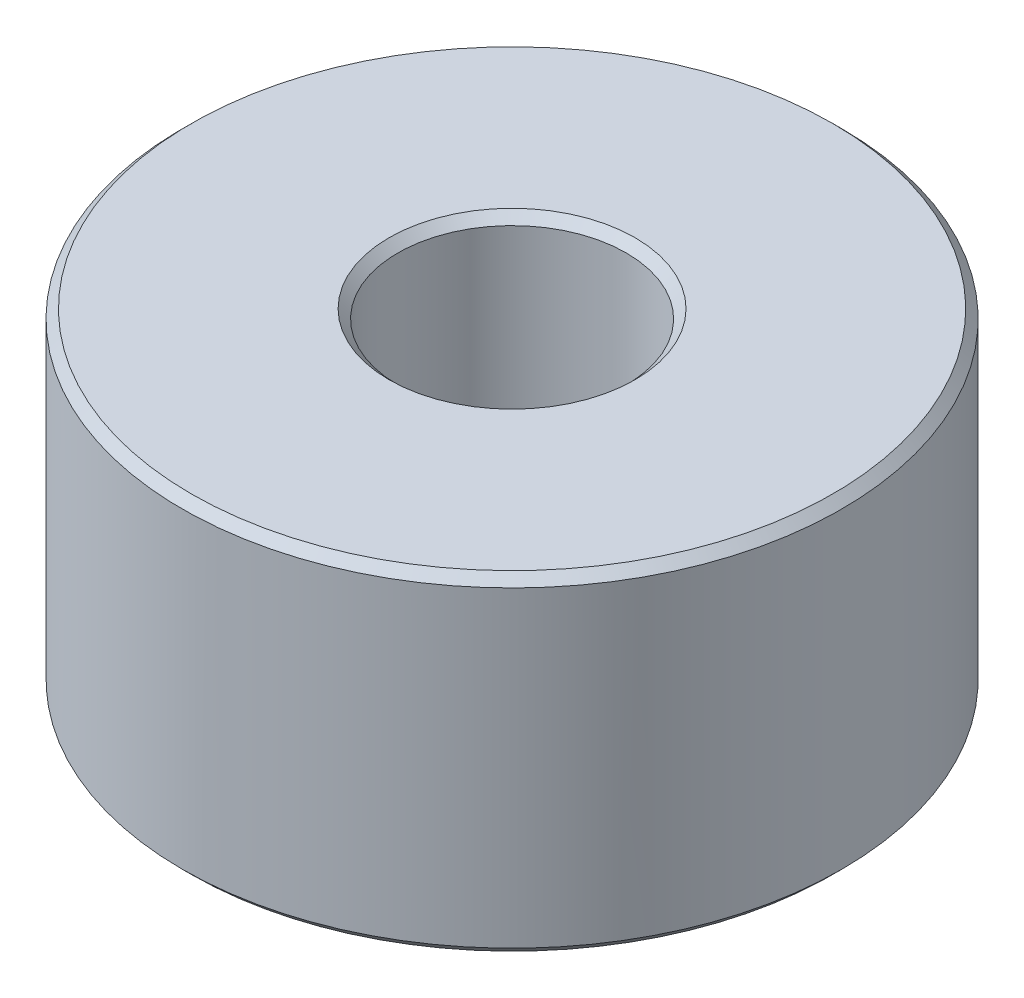
ISO-10303-21;
HEADER;
FILE_DESCRIPTION(('STEP AP214'),'2;1');
FILE_NAME('part.step','',(''),(''),'','','');
FILE_SCHEMA(('AUTOMOTIVE_DESIGN { 1 0 10303 214 1 1 1 1 }'));
ENDSEC;
DATA;
#1=APPLICATION_CONTEXT('core data for automotive mechanical design processes');
#2=APPLICATION_PROTOCOL_DEFINITION('international standard','automotive_design',2000,#1);
#3=PRODUCT_CONTEXT('',#1,'mechanical');
#4=PRODUCT('Part','Part','',(#3));
#5=PRODUCT_RELATED_PRODUCT_CATEGORY('part','',(#4));
#6=PRODUCT_DEFINITION_FORMATION('','',#4);
#7=PRODUCT_DEFINITION_CONTEXT('part definition',#1,'design');
#8=PRODUCT_DEFINITION('design','',#6,#7);
#9=PRODUCT_DEFINITION_SHAPE('','',#8);
#10=(LENGTH_UNIT() NAMED_UNIT(*) SI_UNIT(.MILLI.,.METRE.));
#11=(NAMED_UNIT(*) PLANE_ANGLE_UNIT() SI_UNIT($,.RADIAN.));
#12=(NAMED_UNIT(*) SI_UNIT($,.STERADIAN.) SOLID_ANGLE_UNIT());
#13=UNCERTAINTY_MEASURE_WITH_UNIT(LENGTH_MEASURE(1.E-05),#10,'distance_accuracy_value','');
#14=(GEOMETRIC_REPRESENTATION_CONTEXT(3) GLOBAL_UNCERTAINTY_ASSIGNED_CONTEXT((#13)) GLOBAL_UNIT_ASSIGNED_CONTEXT((#10,
#11,#12)) REPRESENTATION_CONTEXT('',''));
#15=CARTESIAN_POINT('',(0.,0.,0.));
#16=DIRECTION('',(0.,0.,1.));
#17=DIRECTION('',(1.,0.,0.));
#18=AXIS2_PLACEMENT_3D('',#15,#16,#17);
#19=CARTESIAN_POINT('',(0.,7.5,0.));
#20=DIRECTION('',(0.,1.,0.));
#21=DIRECTION('',(0.,0.,1.));
#22=AXIS2_PLACEMENT_3D('',#19,#20,#21);
#23=PLANE('',#22);
#24=CARTESIAN_POINT('',(0.,7.5,0.));
#25=DIRECTION('',(0.,1.,0.));
#26=DIRECTION('',(0.,0.,1.));
#27=AXIS2_PLACEMENT_3D('',#24,#25,#26);
#28=CIRCLE('',#27,2.8);
#29=CARTESIAN_POINT('',(0.,7.5,2.8));
#30=VERTEX_POINT('',#29);
#31=EDGE_CURVE('E10',#30,#30,#28,.F.);
#32=ORIENTED_EDGE('',*,*,#31,.T.);
#33=EDGE_LOOP('',(#32));
#34=FACE_BOUND('',#33,.T.);
#35=CARTESIAN_POINT('',(0.,7.5,0.));
#36=DIRECTION('',(0.,1.,0.));
#37=DIRECTION('',(0.,0.,1.));
#38=AXIS2_PLACEMENT_3D('',#35,#36,#37);
#39=CIRCLE('',#38,7.3);
#40=CARTESIAN_POINT('',(0.,7.5,-7.3));
#41=VERTEX_POINT('',#40);
#42=EDGE_CURVE('E48',#41,#41,#39,.T.);
#43=ORIENTED_EDGE('',*,*,#42,.T.);
#44=EDGE_LOOP('',(#43));
#45=FACE_BOUND('',#44,.T.);
#46=ADVANCED_FACE('F39',(#34,#45),#23,.T.);
#47=CARTESIAN_POINT('',(0.,0.,0.));
#48=DIRECTION('',(0.,1.,0.));
#49=DIRECTION('',(0.,0.,1.));
#50=AXIS2_PLACEMENT_3D('',#47,#48,#49);
#51=PLANE('',#50);
#52=CARTESIAN_POINT('',(0.,0.,0.));
#53=DIRECTION('',(0.,1.,0.));
#54=DIRECTION('',(0.,0.,1.));
#55=AXIS2_PLACEMENT_3D('',#52,#53,#54);
#56=CIRCLE('',#55,2.8);
#57=CARTESIAN_POINT('',(0.,0.,2.8));
#58=VERTEX_POINT('',#57);
#59=EDGE_CURVE('E72',#58,#58,#56,.T.);
#60=ORIENTED_EDGE('',*,*,#59,.T.);
#61=EDGE_LOOP('',(#60));
#62=FACE_BOUND('',#61,.T.);
#63=CARTESIAN_POINT('',(0.,0.,0.));
#64=DIRECTION('',(0.,1.,0.));
#65=DIRECTION('',(0.,0.,1.));
#66=AXIS2_PLACEMENT_3D('',#63,#64,#65);
#67=CIRCLE('',#66,7.3);
#68=CARTESIAN_POINT('',(0.,0.,7.3));
#69=VERTEX_POINT('',#68);
#70=EDGE_CURVE('E76',#69,#69,#67,.F.);
#71=ORIENTED_EDGE('',*,*,#70,.T.);
#72=EDGE_LOOP('',(#71));
#73=FACE_BOUND('',#72,.T.);
#74=ADVANCED_FACE('F81',(#62,#73),#51,.F.);
#75=CARTESIAN_POINT('',(0.,7.5,0.));
#76=DIRECTION('',(0.,-1.,0.));
#77=DIRECTION('',(0.,0.,-1.));
#78=AXIS2_PLACEMENT_3D('',#75,#76,#77);
#79=CYLINDRICAL_SURFACE('',#78,7.5);
#80=CARTESIAN_POINT('',(0.,0.200000000000002,0.));
#81=DIRECTION('',(0.,1.,0.));
#82=DIRECTION('',(0.,0.,1.));
#83=AXIS2_PLACEMENT_3D('',#80,#81,#82);
#84=CIRCLE('',#83,7.5);
#85=CARTESIAN_POINT('',(0.,0.200000000000002,7.5));
#86=VERTEX_POINT('',#85);
#87=EDGE_CURVE('E53',#86,#86,#84,.T.);
#88=ORIENTED_EDGE('',*,*,#87,.T.);
#89=EDGE_LOOP('',(#88));
#90=FACE_BOUND('',#89,.T.);
#91=CARTESIAN_POINT('',(0.,7.3,0.));
#92=DIRECTION('',(0.,1.,0.));
#93=DIRECTION('',(0.,0.,1.));
#94=AXIS2_PLACEMENT_3D('',#91,#92,#93);
#95=CIRCLE('',#94,7.5);
#96=CARTESIAN_POINT('',(0.,7.3,-7.5));
#97=VERTEX_POINT('',#96);
#98=EDGE_CURVE('E58',#97,#97,#95,.F.);
#99=ORIENTED_EDGE('',*,*,#98,.T.);
#100=EDGE_LOOP('',(#99));
#101=FACE_BOUND('',#100,.T.);
#102=ADVANCED_FACE('F91',(#90,#101),#79,.T.);
#103=CARTESIAN_POINT('',(0.,7.5,0.));
#104=DIRECTION('',(0.,-1.,0.));
#105=DIRECTION('',(0.,0.,-1.));
#106=AXIS2_PLACEMENT_3D('',#103,#104,#105);
#107=CYLINDRICAL_SURFACE('',#106,2.6);
#108=CARTESIAN_POINT('',(0.,0.199999999999997,0.));
#109=DIRECTION('',(0.,1.,0.));
#110=DIRECTION('',(0.,0.,1.));
#111=AXIS2_PLACEMENT_3D('',#108,#109,#110);
#112=CIRCLE('',#111,2.6);
#113=CARTESIAN_POINT('',(0.,0.199999999999997,2.6));
#114=VERTEX_POINT('',#113);
#115=EDGE_CURVE('E64',#114,#114,#112,.F.);
#116=ORIENTED_EDGE('',*,*,#115,.T.);
#117=EDGE_LOOP('',(#116));
#118=FACE_BOUND('',#117,.T.);
#119=CARTESIAN_POINT('',(0.,7.30000000000001,0.));
#120=DIRECTION('',(0.,1.,0.));
#121=DIRECTION('',(0.,0.,1.));
#122=AXIS2_PLACEMENT_3D('',#119,#120,#121);
#123=CIRCLE('',#122,2.6);
#124=CARTESIAN_POINT('',(0.,7.30000000000001,2.6));
#125=VERTEX_POINT('',#124);
#126=EDGE_CURVE('E68',#125,#125,#123,.T.);
#127=ORIENTED_EDGE('',*,*,#126,.T.);
#128=EDGE_LOOP('',(#127));
#129=FACE_BOUND('',#128,.T.);
#130=ADVANCED_FACE('F94',(#118,#129),#107,.F.);
#131=CARTESIAN_POINT('',(0.,0.,0.));
#132=DIRECTION('',(0.,-1.,0.));
#133=DIRECTION('',(0.,0.,-1.));
#134=AXIS2_PLACEMENT_3D('',#131,#132,#133);
#135=CONICAL_SURFACE('',#134,2.8,0.785398163397444);
#136=ORIENTED_EDGE('',*,*,#115,.F.);
#137=EDGE_LOOP('',(#136));
#138=FACE_BOUND('',#137,.T.);
#139=ORIENTED_EDGE('',*,*,#59,.F.);
#140=EDGE_LOOP('',(#139));
#141=FACE_BOUND('',#140,.T.);
#142=ADVANCED_FACE('F87',(#138,#141),#135,.F.);
#143=CARTESIAN_POINT('',(0.,0.200000000000002,0.));
#144=DIRECTION('',(0.,1.,0.));
#145=DIRECTION('',(0.,0.,1.));
#146=AXIS2_PLACEMENT_3D('',#143,#144,#145);
#147=CONICAL_SURFACE('',#146,7.5,0.785398163397455);
#148=ORIENTED_EDGE('',*,*,#70,.F.);
#149=EDGE_LOOP('',(#148));
#150=FACE_BOUND('',#149,.T.);
#151=ORIENTED_EDGE('',*,*,#87,.F.);
#152=EDGE_LOOP('',(#151));
#153=FACE_BOUND('',#152,.T.);
#154=ADVANCED_FACE('F83',(#150,#153),#147,.T.);
#155=CARTESIAN_POINT('',(0.,7.30000000000001,0.));
#156=DIRECTION('',(0.,1.,0.));
#157=DIRECTION('',(0.,0.,1.));
#158=AXIS2_PLACEMENT_3D('',#155,#156,#157);
#159=CONICAL_SURFACE('',#158,2.6,0.785398163397457);
#160=CARTESIAN_POINT('',(0.,7.5,2.8));
#161=CARTESIAN_POINT('',(0.,7.49791666666667,2.79791666666666));
#162=CARTESIAN_POINT('',(0.,7.49583333333333,2.79583333333333));
#163=CARTESIAN_POINT('',(0.,7.49166666666667,2.79166666666666));
#164=CARTESIAN_POINT('',(0.,7.48958333333333,2.78958333333333));
#165=CARTESIAN_POINT('',(0.,7.48541666666667,2.78541666666666));
#166=CARTESIAN_POINT('',(0.,7.48333333333333,2.78333333333333));
#167=CARTESIAN_POINT('',(0.,7.47916666666667,2.77916666666666));
#168=CARTESIAN_POINT('',(0.,7.47708333333333,2.77708333333333));
#169=CARTESIAN_POINT('',(0.,7.47291666666667,2.77291666666666));
#170=CARTESIAN_POINT('',(0.,7.47083333333333,2.77083333333333));
#171=CARTESIAN_POINT('',(0.,7.46666666666667,2.76666666666666));
#172=CARTESIAN_POINT('',(0.,7.46458333333333,2.76458333333333));
#173=CARTESIAN_POINT('',(0.,7.46041666666667,2.76041666666666));
#174=CARTESIAN_POINT('',(0.,7.45833333333333,2.75833333333333));
#175=CARTESIAN_POINT('',(0.,7.45416666666667,2.75416666666666));
#176=CARTESIAN_POINT('',(0.,7.45208333333333,2.75208333333333));
#177=CARTESIAN_POINT('',(0.,7.44791666666667,2.74791666666666));
#178=CARTESIAN_POINT('',(0.,7.44583333333333,2.74583333333333));
#179=CARTESIAN_POINT('',(0.,7.44166666666667,2.74166666666666));
#180=CARTESIAN_POINT('',(0.,7.43958333333333,2.73958333333333));
#181=CARTESIAN_POINT('',(0.,7.43541666666667,2.73541666666666));
#182=CARTESIAN_POINT('',(0.,7.43333333333333,2.73333333333333));
#183=CARTESIAN_POINT('',(0.,7.42916666666667,2.72916666666666));
#184=CARTESIAN_POINT('',(0.,7.42708333333333,2.72708333333333));
#185=CARTESIAN_POINT('',(0.,7.42291666666667,2.72291666666666));
#186=CARTESIAN_POINT('',(0.,7.42083333333334,2.72083333333333));
#187=CARTESIAN_POINT('',(0.,7.41666666666667,2.71666666666666));
#188=CARTESIAN_POINT('',(0.,7.41458333333334,2.71458333333333));
#189=CARTESIAN_POINT('',(0.,7.41041666666667,2.71041666666666));
#190=CARTESIAN_POINT('',(0.,7.40833333333333,2.70833333333333));
#191=CARTESIAN_POINT('',(0.,7.40416666666667,2.70416666666666));
#192=CARTESIAN_POINT('',(0.,7.40208333333334,2.70208333333333));
#193=CARTESIAN_POINT('',(0.,7.39791666666667,2.69791666666666));
#194=CARTESIAN_POINT('',(0.,7.39583333333334,2.69583333333333));
#195=CARTESIAN_POINT('',(0.,7.39166666666667,2.69166666666666));
#196=CARTESIAN_POINT('',(0.,7.38958333333334,2.68958333333333));
#197=CARTESIAN_POINT('',(0.,7.38541666666667,2.68541666666667));
#198=CARTESIAN_POINT('',(0.,7.38333333333334,2.68333333333333));
#199=CARTESIAN_POINT('',(0.,7.37916666666667,2.67916666666667));
#200=CARTESIAN_POINT('',(0.,7.37708333333334,2.67708333333333));
#201=CARTESIAN_POINT('',(0.,7.37291666666667,2.67291666666667));
#202=CARTESIAN_POINT('',(0.,7.37083333333334,2.67083333333333));
#203=CARTESIAN_POINT('',(0.,7.36666666666667,2.66666666666666));
#204=CARTESIAN_POINT('',(0.,7.36458333333334,2.66458333333333));
#205=CARTESIAN_POINT('',(0.,7.36041666666667,2.66041666666667));
#206=CARTESIAN_POINT('',(0.,7.35833333333334,2.65833333333333));
#207=CARTESIAN_POINT('',(0.,7.35416666666667,2.65416666666667));
#208=CARTESIAN_POINT('',(0.,7.35208333333334,2.65208333333333));
#209=CARTESIAN_POINT('',(0.,7.34791666666667,2.64791666666667));
#210=CARTESIAN_POINT('',(0.,7.34583333333334,2.64583333333333));
#211=CARTESIAN_POINT('',(0.,7.34166666666667,2.64166666666667));
#212=CARTESIAN_POINT('',(0.,7.33958333333334,2.63958333333333));
#213=CARTESIAN_POINT('',(0.,7.33541666666667,2.63541666666667));
#214=CARTESIAN_POINT('',(0.,7.33333333333334,2.63333333333333));
#215=CARTESIAN_POINT('',(0.,7.32916666666667,2.62916666666667));
#216=CARTESIAN_POINT('',(0.,7.32708333333334,2.62708333333333));
#217=CARTESIAN_POINT('',(0.,7.32291666666667,2.62291666666667));
#218=CARTESIAN_POINT('',(0.,7.32083333333334,2.62083333333333));
#219=CARTESIAN_POINT('',(0.,7.31666666666667,2.61666666666667));
#220=CARTESIAN_POINT('',(0.,7.31458333333334,2.61458333333333));
#221=CARTESIAN_POINT('',(0.,7.31041666666667,2.61041666666667));
#222=CARTESIAN_POINT('',(0.,7.30833333333334,2.60833333333333));
#223=CARTESIAN_POINT('',(0.,7.30416666666667,2.60416666666667));
#224=CARTESIAN_POINT('',(0.,7.30208333333334,2.60208333333333));
#225=CARTESIAN_POINT('',(0.,7.30000000000001,2.6));
#226=B_SPLINE_CURVE_WITH_KNOTS('',3,(#160,#161,#162,#163,#164,#165,#166,#167,#168,#169,#170,
#171,#172,#173,#174,#175,#176,#177,#178,#179,#180,#181,#182,#183,#184,#185,#186,#187,#188,#189,
#190,#191,#192,#193,#194,#195,#196,#197,#198,#199,#200,#201,#202,#203,#204,#205,#206,#207,#208,
#209,#210,#211,#212,#213,#214,#215,#216,#217,#218,#219,#220,#221,#222,#223,#224,#225),
.UNSPECIFIED.,.F.,.F.,(4,2,2,2,2,2,2,2,2,2,2,2,2,2,2,2,2,2,2,2,2,2,2,2,2,2,2,2,2,2,2,2,4),(0.,
0.00883883476483118,0.0176776695296633,0.0265165042944944,0.0353553390593262,0.0441941738241577,
0.0530330085889895,0.061871843353821,0.0707106781186528,0.0795495128834846,0.088388347648316,
0.0972271824131478,0.106066017177979,0.114904851942811,0.123743686707642,0.132582521472474,
0.141421356237306,0.150260191002137,0.159099025766969,0.167937860531801,0.176776695296632,
0.185615530061464,0.194454364826296,0.203293199591127,0.212132034355959,0.220970869120791,
0.229809703885622,0.238648538650454,0.247487373415286,0.256326208180117,0.265165042944949,
0.274003877709781,0.282842712474612),.UNSPECIFIED.);
#227=EDGE_CURVE('BSEAM86',#30,#125,#226,.T.);
#228=ORIENTED_EDGE('',*,*,#31,.F.);
#229=ORIENTED_EDGE('',*,*,#126,.F.);
#230=ORIENTED_EDGE('',*,*,#227,.T.);
#231=ORIENTED_EDGE('',*,*,#227,.F.);
#232=EDGE_LOOP('',(#228,#230,#229,#231));
#233=FACE_BOUND('',#232,.T.);
#234=ADVANCED_FACE('F86',(#233),#159,.F.);
#235=CARTESIAN_POINT('',(0.,7.5,0.));
#236=DIRECTION('',(0.,-1.,0.));
#237=DIRECTION('',(0.,0.,-1.));
#238=AXIS2_PLACEMENT_3D('',#235,#236,#237);
#239=CONICAL_SURFACE('',#238,7.3,0.785398163397448);
#240=CARTESIAN_POINT('',(0.,7.3,-7.5));
#241=CARTESIAN_POINT('',(0.,7.30208333333333,-7.49791666666667));
#242=CARTESIAN_POINT('',(0.,7.30416666666667,-7.49583333333333));
#243=CARTESIAN_POINT('',(0.,7.30833333333333,-7.49166666666667));
#244=CARTESIAN_POINT('',(0.,7.31041666666667,-7.48958333333333));
#245=CARTESIAN_POINT('',(0.,7.31458333333333,-7.48541666666667));
#246=CARTESIAN_POINT('',(0.,7.31666666666667,-7.48333333333333));
#247=CARTESIAN_POINT('',(0.,7.32083333333333,-7.47916666666667));
#248=CARTESIAN_POINT('',(0.,7.32291666666667,-7.47708333333333));
#249=CARTESIAN_POINT('',(0.,7.32708333333333,-7.47291666666667));
#250=CARTESIAN_POINT('',(0.,7.32916666666667,-7.47083333333333));
#251=CARTESIAN_POINT('',(0.,7.33333333333333,-7.46666666666667));
#252=CARTESIAN_POINT('',(0.,7.33541666666667,-7.46458333333333));
#253=CARTESIAN_POINT('',(0.,7.33958333333333,-7.46041666666667));
#254=CARTESIAN_POINT('',(0.,7.34166666666667,-7.45833333333333));
#255=CARTESIAN_POINT('',(0.,7.34583333333333,-7.45416666666667));
#256=CARTESIAN_POINT('',(0.,7.34791666666667,-7.45208333333333));
#257=CARTESIAN_POINT('',(0.,7.35208333333333,-7.44791666666667));
#258=CARTESIAN_POINT('',(0.,7.35416666666667,-7.44583333333333));
#259=CARTESIAN_POINT('',(0.,7.35833333333333,-7.44166666666667));
#260=CARTESIAN_POINT('',(0.,7.36041666666667,-7.43958333333333));
#261=CARTESIAN_POINT('',(0.,7.36458333333333,-7.43541666666667));
#262=CARTESIAN_POINT('',(0.,7.36666666666667,-7.43333333333333));
#263=CARTESIAN_POINT('',(0.,7.37083333333333,-7.42916666666667));
#264=CARTESIAN_POINT('',(0.,7.37291666666667,-7.42708333333333));
#265=CARTESIAN_POINT('',(0.,7.37708333333333,-7.42291666666667));
#266=CARTESIAN_POINT('',(0.,7.37916666666667,-7.42083333333333));
#267=CARTESIAN_POINT('',(0.,7.38333333333333,-7.41666666666667));
#268=CARTESIAN_POINT('',(0.,7.38541666666667,-7.41458333333333));
#269=CARTESIAN_POINT('',(0.,7.38958333333333,-7.41041666666667));
#270=CARTESIAN_POINT('',(0.,7.39166666666667,-7.40833333333333));
#271=CARTESIAN_POINT('',(0.,7.39583333333333,-7.40416666666667));
#272=CARTESIAN_POINT('',(0.,7.39791666666667,-7.40208333333333));
#273=CARTESIAN_POINT('',(0.,7.40208333333333,-7.39791666666667));
#274=CARTESIAN_POINT('',(0.,7.40416666666667,-7.39583333333333));
#275=CARTESIAN_POINT('',(0.,7.40833333333333,-7.39166666666667));
#276=CARTESIAN_POINT('',(0.,7.41041666666667,-7.38958333333333));
#277=CARTESIAN_POINT('',(0.,7.41458333333333,-7.38541666666667));
#278=CARTESIAN_POINT('',(0.,7.41666666666667,-7.38333333333333));
#279=CARTESIAN_POINT('',(0.,7.42083333333333,-7.37916666666667));
#280=CARTESIAN_POINT('',(0.,7.42291666666667,-7.37708333333333));
#281=CARTESIAN_POINT('',(0.,7.42708333333333,-7.37291666666667));
#282=CARTESIAN_POINT('',(0.,7.42916666666667,-7.37083333333333));
#283=CARTESIAN_POINT('',(0.,7.43333333333333,-7.36666666666667));
#284=CARTESIAN_POINT('',(0.,7.43541666666667,-7.36458333333333));
#285=CARTESIAN_POINT('',(0.,7.43958333333333,-7.36041666666667));
#286=CARTESIAN_POINT('',(0.,7.44166666666667,-7.35833333333334));
#287=CARTESIAN_POINT('',(0.,7.44583333333333,-7.35416666666667));
#288=CARTESIAN_POINT('',(0.,7.44791666666667,-7.35208333333333));
#289=CARTESIAN_POINT('',(0.,7.45208333333333,-7.34791666666667));
#290=CARTESIAN_POINT('',(0.,7.45416666666667,-7.34583333333333));
#291=CARTESIAN_POINT('',(0.,7.45833333333333,-7.34166666666667));
#292=CARTESIAN_POINT('',(0.,7.46041666666667,-7.33958333333333));
#293=CARTESIAN_POINT('',(0.,7.46458333333333,-7.33541666666667));
#294=CARTESIAN_POINT('',(0.,7.46666666666667,-7.33333333333333));
#295=CARTESIAN_POINT('',(0.,7.47083333333333,-7.32916666666667));
#296=CARTESIAN_POINT('',(0.,7.47291666666667,-7.32708333333334));
#297=CARTESIAN_POINT('',(0.,7.47708333333333,-7.32291666666667));
#298=CARTESIAN_POINT('',(0.,7.47916666666667,-7.32083333333333));
#299=CARTESIAN_POINT('',(0.,7.48333333333333,-7.31666666666667));
#300=CARTESIAN_POINT('',(0.,7.48541666666667,-7.31458333333333));
#301=CARTESIAN_POINT('',(0.,7.48958333333333,-7.31041666666667));
#302=CARTESIAN_POINT('',(0.,7.49166666666667,-7.30833333333333));
#303=CARTESIAN_POINT('',(0.,7.49583333333333,-7.30416666666667));
#304=CARTESIAN_POINT('',(0.,7.49791666666667,-7.30208333333333));
#305=CARTESIAN_POINT('',(0.,7.5,-7.3));
#306=B_SPLINE_CURVE_WITH_KNOTS('',3,(#240,#241,#242,#243,#244,#245,#246,#247,#248,#249,#250,
#251,#252,#253,#254,#255,#256,#257,#258,#259,#260,#261,#262,#263,#264,#265,#266,#267,#268,#269,
#270,#271,#272,#273,#274,#275,#276,#277,#278,#279,#280,#281,#282,#283,#284,#285,#286,#287,#288,
#289,#290,#291,#292,#293,#294,#295,#296,#297,#298,#299,#300,#301,#302,#303,#304,#305),
.UNSPECIFIED.,.F.,.F.,(4,2,2,2,2,2,2,2,2,2,2,2,2,2,2,2,2,2,2,2,2,2,2,2,2,2,2,2,2,2,2,2,4),(0.,
0.00883883476483148,0.0176776695296636,0.0265165042944957,0.0353553390593278,0.0441941738241586,
0.0530330085889907,0.0618718433538228,0.0707106781186549,0.0795495128834871,0.0883883476483179,
0.09722718241315,0.106066017177982,0.114904851942814,0.123743686707645,0.132582521472477,
0.141421356237309,0.150260191002141,0.159099025766973,0.167937860531804,0.176776695296636,
0.185615530061469,0.194454364826301,0.203293199591132,0.212132034355964,0.220970869120796,
0.229809703885628,0.23864853865046,0.247487373415291,0.256326208180123,0.265165042944955,
0.274003877709787,0.282842712474619),.UNSPECIFIED.);
#307=EDGE_CURVE('BSEAM42',#97,#41,#306,.T.);
#308=ORIENTED_EDGE('',*,*,#98,.F.);
#309=ORIENTED_EDGE('',*,*,#42,.F.);
#310=ORIENTED_EDGE('',*,*,#307,.T.);
#311=ORIENTED_EDGE('',*,*,#307,.F.);
#312=EDGE_LOOP('',(#308,#310,#309,#311));
#313=FACE_BOUND('',#312,.T.);
#314=ADVANCED_FACE('F42',(#313),#239,.T.);
#315=CLOSED_SHELL('',(#46,#74,#102,#130,#142,#154,#234,#314));
#316=MANIFOLD_SOLID_BREP('B2',#315);
#317=ADVANCED_BREP_SHAPE_REPRESENTATION('',(#18,#316),#14);
#318=SHAPE_DEFINITION_REPRESENTATION(#9,#317);
ENDSEC;
END-ISO-10303-21;
